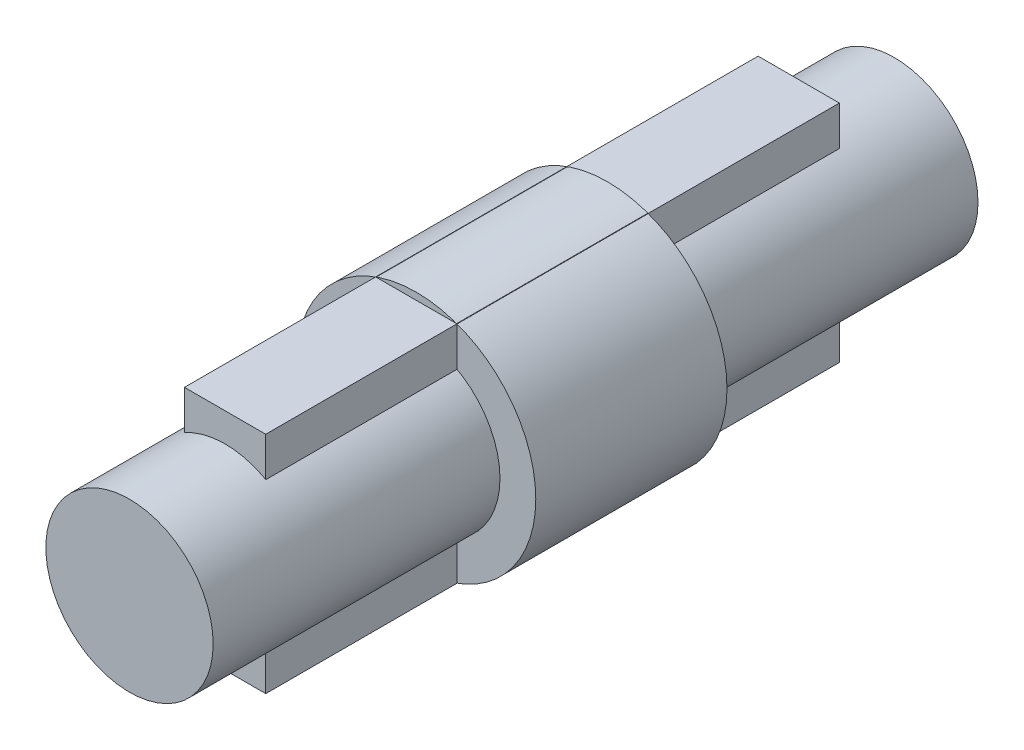
ISO-10303-21;
HEADER;
FILE_DESCRIPTION(('STEP AP214'),'2;1');
FILE_NAME('part.step','',(''),(''),'','','');
FILE_SCHEMA(('AUTOMOTIVE_DESIGN { 1 0 10303 214 1 1 1 1 }'));
ENDSEC;
DATA;
#1=APPLICATION_CONTEXT('core data for automotive mechanical design processes');
#2=APPLICATION_PROTOCOL_DEFINITION('international standard','automotive_design',2000,#1);
#3=PRODUCT_CONTEXT('',#1,'mechanical');
#4=PRODUCT('Part','Part','',(#3));
#5=PRODUCT_RELATED_PRODUCT_CATEGORY('part','',(#4));
#6=PRODUCT_DEFINITION_FORMATION('','',#4);
#7=PRODUCT_DEFINITION_CONTEXT('part definition',#1,'design');
#8=PRODUCT_DEFINITION('design','',#6,#7);
#9=PRODUCT_DEFINITION_SHAPE('','',#8);
#10=(LENGTH_UNIT() NAMED_UNIT(*) SI_UNIT(.MILLI.,.METRE.));
#11=(NAMED_UNIT(*) PLANE_ANGLE_UNIT() SI_UNIT($,.RADIAN.));
#12=(NAMED_UNIT(*) SI_UNIT($,.STERADIAN.) SOLID_ANGLE_UNIT());
#13=UNCERTAINTY_MEASURE_WITH_UNIT(LENGTH_MEASURE(1.E-05),#10,'distance_accuracy_value','');
#14=(GEOMETRIC_REPRESENTATION_CONTEXT(3) GLOBAL_UNCERTAINTY_ASSIGNED_CONTEXT((#13)) GLOBAL_UNIT_ASSIGNED_CONTEXT((#10,
#11,#12)) REPRESENTATION_CONTEXT('',''));
#15=CARTESIAN_POINT('',(0.,0.,0.));
#16=DIRECTION('',(0.,0.,1.));
#17=DIRECTION('',(1.,0.,0.));
#18=AXIS2_PLACEMENT_3D('',#15,#16,#17);
#19=CARTESIAN_POINT('',(0.,0.,8.));
#20=DIRECTION('',(0.,0.,-1.));
#21=DIRECTION('',(-1.,0.,0.));
#22=AXIS2_PLACEMENT_3D('',#19,#20,#21);
#23=CYLINDRICAL_SURFACE('',#22,1.75);
#24=CARTESIAN_POINT('',(0.,0.,8.));
#25=DIRECTION('',(0.,0.,1.));
#26=DIRECTION('',(1.,0.,0.));
#27=AXIS2_PLACEMENT_3D('',#24,#25,#26);
#28=CIRCLE('',#27,1.75);
#29=CARTESIAN_POINT('',(1.75,0.,8.));
#30=VERTEX_POINT('',#29);
#31=EDGE_CURVE('E11',#30,#30,#28,.T.);
#32=ORIENTED_EDGE('',*,*,#31,.F.);
#33=EDGE_LOOP('',(#32));
#34=FACE_BOUND('',#33,.T.);
#35=CARTESIAN_POINT('',(0.,0.,-8.));
#36=DIRECTION('',(0.,0.,1.));
#37=DIRECTION('',(1.,0.,0.));
#38=AXIS2_PLACEMENT_3D('',#35,#36,#37);
#39=CIRCLE('',#38,1.75);
#40=CARTESIAN_POINT('',(1.75,0.,-8.));
#41=VERTEX_POINT('',#40);
#42=EDGE_CURVE('E53',#41,#41,#39,.T.);
#43=ORIENTED_EDGE('',*,*,#42,.T.);
#44=EDGE_LOOP('',(#43));
#45=FACE_BOUND('',#44,.T.);
#46=ADVANCED_FACE('F50',(#34,#45),#23,.T.);
#47=CARTESIAN_POINT('',(0.,0.,8.));
#48=DIRECTION('',(0.,0.,1.));
#49=DIRECTION('',(1.,0.,0.));
#50=AXIS2_PLACEMENT_3D('',#47,#48,#49);
#51=PLANE('',#50);
#52=ORIENTED_EDGE('',*,*,#31,.T.);
#53=EDGE_LOOP('',(#52));
#54=FACE_BOUND('',#53,.T.);
#55=ADVANCED_FACE('F65',(#54),#51,.T.);
#56=CARTESIAN_POINT('',(0.,0.,-8.));
#57=DIRECTION('',(0.,0.,1.));
#58=DIRECTION('',(1.,0.,0.));
#59=AXIS2_PLACEMENT_3D('',#56,#57,#58);
#60=PLANE('',#59);
#61=ORIENTED_EDGE('',*,*,#42,.F.);
#62=EDGE_LOOP('',(#61));
#63=FACE_BOUND('',#62,.T.);
#64=ADVANCED_FACE('F63',(#63),#60,.F.);
#65=CLOSED_SHELL('',(#46,#55,#64));
#66=MANIFOLD_SOLID_BREP('B2',#65);
#67=CARTESIAN_POINT('',(0.85,0.,6.));
#68=DIRECTION('',(1.,0.,0.));
#69=DIRECTION('',(0.,1.,0.));
#70=AXIS2_PLACEMENT_3D('',#67,#68,#69);
#71=PLANE('',#70);
#72=DIRECTION('',(0.,-1.,0.));
#73=VECTOR('',#72,1.);
#74=CARTESIAN_POINT('',(0.85,0.,-6.));
#75=LINE('',#74,#73);
#76=CARTESIAN_POINT('',(0.85,2.35,-6.));
#77=VERTEX_POINT('',#76);
#78=CARTESIAN_POINT('',(0.849999999999999,-2.35,-6.));
#79=VERTEX_POINT('',#78);
#80=EDGE_CURVE('E179',#77,#79,#75,.T.);
#81=ORIENTED_EDGE('',*,*,#80,.F.);
#82=DIRECTION('',(0.,0.,-1.));
#83=VECTOR('',#82,1.);
#84=CARTESIAN_POINT('',(0.85,2.35,6.));
#85=LINE('',#84,#83);
#86=CARTESIAN_POINT('',(0.85,2.35,6.));
#87=VERTEX_POINT('',#86);
#88=EDGE_CURVE('E48',#87,#77,#85,.T.);
#89=ORIENTED_EDGE('',*,*,#88,.F.);
#90=DIRECTION('',(0.,-1.,0.));
#91=VECTOR('',#90,1.);
#92=CARTESIAN_POINT('',(0.85,0.,6.));
#93=LINE('',#92,#91);
#94=CARTESIAN_POINT('',(0.849999999999999,-2.35,6.));
#95=VERTEX_POINT('',#94);
#96=EDGE_CURVE('E164',#87,#95,#93,.T.);
#97=ORIENTED_EDGE('',*,*,#96,.T.);
#98=DIRECTION('',(0.,0.,-1.));
#99=VECTOR('',#98,1.);
#100=CARTESIAN_POINT('',(0.849999999999999,-2.35,6.));
#101=LINE('',#100,#99);
#102=EDGE_CURVE('E132',#95,#79,#101,.T.);
#103=ORIENTED_EDGE('',*,*,#102,.T.);
#104=EDGE_LOOP('',(#81,#89,#97,#103));
#105=FACE_BOUND('',#104,.T.);
#106=ADVANCED_FACE('F116',(#105),#71,.T.);
#107=CARTESIAN_POINT('',(0.,2.35,6.));
#108=DIRECTION('',(0.,-1.,0.));
#109=DIRECTION('',(0.,0.,-1.));
#110=AXIS2_PLACEMENT_3D('',#107,#108,#109);
#111=PLANE('',#110);
#112=DIRECTION('',(-1.,0.,0.));
#113=VECTOR('',#112,1.);
#114=CARTESIAN_POINT('',(0.,2.35,-6.));
#115=LINE('',#114,#113);
#116=CARTESIAN_POINT('',(-0.85,2.35,-6.));
#117=VERTEX_POINT('',#116);
#118=EDGE_CURVE('E170',#77,#117,#115,.T.);
#119=ORIENTED_EDGE('',*,*,#118,.T.);
#120=DIRECTION('',(0.,0.,-1.));
#121=VECTOR('',#120,1.);
#122=CARTESIAN_POINT('',(-0.85,2.35,6.));
#123=LINE('',#122,#121);
#124=CARTESIAN_POINT('',(-0.85,2.35,6.));
#125=VERTEX_POINT('',#124);
#126=EDGE_CURVE('E124',#125,#117,#123,.T.);
#127=ORIENTED_EDGE('',*,*,#126,.F.);
#128=DIRECTION('',(-1.,0.,0.));
#129=VECTOR('',#128,1.);
#130=CARTESIAN_POINT('',(0.,2.35,6.));
#131=LINE('',#130,#129);
#132=EDGE_CURVE('E158',#87,#125,#131,.T.);
#133=ORIENTED_EDGE('',*,*,#132,.F.);
#134=ORIENTED_EDGE('',*,*,#88,.T.);
#135=EDGE_LOOP('',(#119,#127,#133,#134));
#136=FACE_BOUND('',#135,.T.);
#137=ADVANCED_FACE('F168',(#136),#111,.F.);
#138=CARTESIAN_POINT('',(-0.85,0.,6.));
#139=DIRECTION('',(1.,0.,0.));
#140=DIRECTION('',(0.,1.,0.));
#141=AXIS2_PLACEMENT_3D('',#138,#139,#140);
#142=PLANE('',#141);
#143=DIRECTION('',(0.,-1.,0.));
#144=VECTOR('',#143,1.);
#145=CARTESIAN_POINT('',(-0.85,0.,-6.));
#146=LINE('',#145,#144);
#147=CARTESIAN_POINT('',(-0.849999999999999,-2.35,-6.));
#148=VERTEX_POINT('',#147);
#149=EDGE_CURVE('E182',#117,#148,#146,.T.);
#150=ORIENTED_EDGE('',*,*,#149,.T.);
#151=DIRECTION('',(0.,0.,-1.));
#152=VECTOR('',#151,1.);
#153=CARTESIAN_POINT('',(-0.849999999999999,-2.35,6.));
#154=LINE('',#153,#152);
#155=CARTESIAN_POINT('',(-0.849999999999999,-2.35,6.));
#156=VERTEX_POINT('',#155);
#157=EDGE_CURVE('E146',#156,#148,#154,.T.);
#158=ORIENTED_EDGE('',*,*,#157,.F.);
#159=DIRECTION('',(0.,-1.,0.));
#160=VECTOR('',#159,1.);
#161=CARTESIAN_POINT('',(-0.85,0.,6.));
#162=LINE('',#161,#160);
#163=EDGE_CURVE('E163',#125,#156,#162,.T.);
#164=ORIENTED_EDGE('',*,*,#163,.F.);
#165=ORIENTED_EDGE('',*,*,#126,.T.);
#166=EDGE_LOOP('',(#150,#158,#164,#165));
#167=FACE_BOUND('',#166,.T.);
#168=ADVANCED_FACE('F173',(#167),#142,.F.);
#169=CARTESIAN_POINT('',(0.,-2.35,6.));
#170=DIRECTION('',(0.,-1.,0.));
#171=DIRECTION('',(0.,0.,-1.));
#172=AXIS2_PLACEMENT_3D('',#169,#170,#171);
#173=PLANE('',#172);
#174=DIRECTION('',(-1.,0.,0.));
#175=VECTOR('',#174,1.);
#176=CARTESIAN_POINT('',(0.,-2.35,-6.));
#177=LINE('',#176,#175);
#178=EDGE_CURVE('E184',#79,#148,#177,.T.);
#179=ORIENTED_EDGE('',*,*,#178,.F.);
#180=ORIENTED_EDGE('',*,*,#102,.F.);
#181=DIRECTION('',(-1.,0.,0.));
#182=VECTOR('',#181,1.);
#183=CARTESIAN_POINT('',(0.,-2.35,6.));
#184=LINE('',#183,#182);
#185=EDGE_CURVE('E174',#95,#156,#184,.T.);
#186=ORIENTED_EDGE('',*,*,#185,.T.);
#187=ORIENTED_EDGE('',*,*,#157,.T.);
#188=EDGE_LOOP('',(#179,#180,#186,#187));
#189=FACE_BOUND('',#188,.T.);
#190=ADVANCED_FACE('F189',(#189),#173,.T.);
#191=CARTESIAN_POINT('',(0.,0.,6.));
#192=DIRECTION('',(0.,0.,1.));
#193=DIRECTION('',(1.,0.,0.));
#194=AXIS2_PLACEMENT_3D('',#191,#192,#193);
#195=PLANE('',#194);
#196=ORIENTED_EDGE('',*,*,#96,.F.);
#197=ORIENTED_EDGE('',*,*,#132,.T.);
#198=ORIENTED_EDGE('',*,*,#163,.T.);
#199=ORIENTED_EDGE('',*,*,#185,.F.);
#200=EDGE_LOOP('',(#196,#197,#198,#199));
#201=FACE_BOUND('',#200,.T.);
#202=ADVANCED_FACE('F160',(#201),#195,.T.);
#203=CARTESIAN_POINT('',(0.,0.,-6.));
#204=DIRECTION('',(0.,0.,1.));
#205=DIRECTION('',(1.,0.,0.));
#206=AXIS2_PLACEMENT_3D('',#203,#204,#205);
#207=PLANE('',#206);
#208=ORIENTED_EDGE('',*,*,#80,.T.);
#209=ORIENTED_EDGE('',*,*,#178,.T.);
#210=ORIENTED_EDGE('',*,*,#149,.F.);
#211=ORIENTED_EDGE('',*,*,#118,.F.);
#212=EDGE_LOOP('',(#208,#209,#210,#211));
#213=FACE_BOUND('',#212,.T.);
#214=ADVANCED_FACE('F196',(#213),#207,.F.);
#215=CLOSED_SHELL('',(#106,#137,#168,#190,#202,#214));
#216=MANIFOLD_SOLID_BREP('B6',#215);
#217=CARTESIAN_POINT('',(0.,0.,2.));
#218=DIRECTION('',(0.,0.,-1.));
#219=DIRECTION('',(-1.,0.,0.));
#220=AXIS2_PLACEMENT_3D('',#217,#218,#219);
#221=CYLINDRICAL_SURFACE('',#220,2.49899979991996);
#222=CARTESIAN_POINT('',(0.,0.,2.));
#223=DIRECTION('',(0.,0.,1.));
#224=DIRECTION('',(1.,0.,0.));
#225=AXIS2_PLACEMENT_3D('',#222,#223,#224);
#226=CIRCLE('',#225,2.49899979991996);
#227=CARTESIAN_POINT('',(2.49899979991996,0.,2.));
#228=VERTEX_POINT('',#227);
#229=EDGE_CURVE('E115',#228,#228,#226,.T.);
#230=ORIENTED_EDGE('',*,*,#229,.F.);
#231=EDGE_LOOP('',(#230));
#232=FACE_BOUND('',#231,.T.);
#233=CARTESIAN_POINT('',(0.,0.,-2.));
#234=DIRECTION('',(0.,0.,1.));
#235=DIRECTION('',(1.,0.,0.));
#236=AXIS2_PLACEMENT_3D('',#233,#234,#235);
#237=CIRCLE('',#236,2.49899979991996);
#238=CARTESIAN_POINT('',(2.49899979991996,0.,-2.));
#239=VERTEX_POINT('',#238);
#240=EDGE_CURVE('E261',#239,#239,#237,.T.);
#241=ORIENTED_EDGE('',*,*,#240,.T.);
#242=EDGE_LOOP('',(#241));
#243=FACE_BOUND('',#242,.T.);
#244=ADVANCED_FACE('F258',(#232,#243),#221,.T.);
#245=CARTESIAN_POINT('',(0.,0.,2.));
#246=DIRECTION('',(0.,0.,1.));
#247=DIRECTION('',(1.,0.,0.));
#248=AXIS2_PLACEMENT_3D('',#245,#246,#247);
#249=PLANE('',#248);
#250=ORIENTED_EDGE('',*,*,#229,.T.);
#251=EDGE_LOOP('',(#250));
#252=FACE_BOUND('',#251,.T.);
#253=ADVANCED_FACE('F273',(#252),#249,.T.);
#254=CARTESIAN_POINT('',(0.,0.,-2.));
#255=DIRECTION('',(0.,0.,1.));
#256=DIRECTION('',(1.,0.,0.));
#257=AXIS2_PLACEMENT_3D('',#254,#255,#256);
#258=PLANE('',#257);
#259=ORIENTED_EDGE('',*,*,#240,.F.);
#260=EDGE_LOOP('',(#259));
#261=FACE_BOUND('',#260,.T.);
#262=ADVANCED_FACE('F271',(#261),#258,.F.);
#263=CLOSED_SHELL('',(#244,#253,#262));
#264=MANIFOLD_SOLID_BREP('B42',#263);
#265=ADVANCED_BREP_SHAPE_REPRESENTATION('',(#18,#66,#216,#264),#14);
#266=SHAPE_DEFINITION_REPRESENTATION(#9,#265);
ENDSEC;
END-ISO-10303-21;
